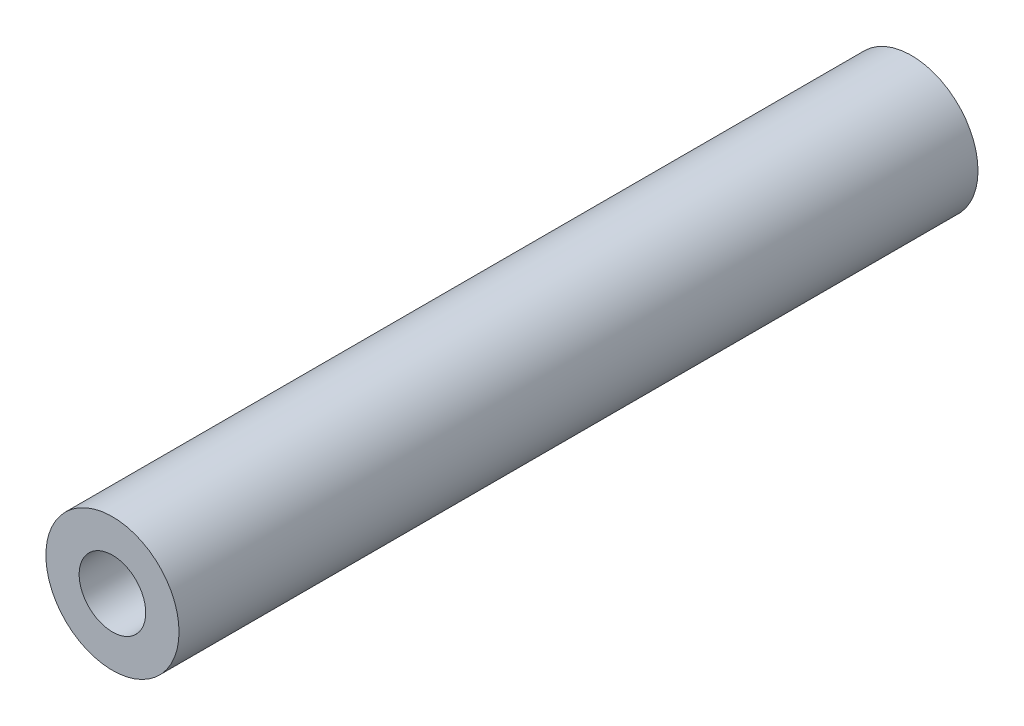
ISO-10303-21;
HEADER;
FILE_DESCRIPTION(('STEP AP214'),'2;1');
FILE_NAME('part.step','',(''),(''),'','','');
FILE_SCHEMA(('AUTOMOTIVE_DESIGN { 1 0 10303 214 1 1 1 1 }'));
ENDSEC;
DATA;
#1=APPLICATION_CONTEXT('core data for automotive mechanical design processes');
#2=APPLICATION_PROTOCOL_DEFINITION('international standard','automotive_design',2000,#1);
#3=PRODUCT_CONTEXT('',#1,'mechanical');
#4=PRODUCT('Part','Part','',(#3));
#5=PRODUCT_RELATED_PRODUCT_CATEGORY('part','',(#4));
#6=PRODUCT_DEFINITION_FORMATION('','',#4);
#7=PRODUCT_DEFINITION_CONTEXT('part definition',#1,'design');
#8=PRODUCT_DEFINITION('design','',#6,#7);
#9=PRODUCT_DEFINITION_SHAPE('','',#8);
#10=(LENGTH_UNIT() NAMED_UNIT(*) SI_UNIT(.MILLI.,.METRE.));
#11=(NAMED_UNIT(*) PLANE_ANGLE_UNIT() SI_UNIT($,.RADIAN.));
#12=(NAMED_UNIT(*) SI_UNIT($,.STERADIAN.) SOLID_ANGLE_UNIT());
#13=UNCERTAINTY_MEASURE_WITH_UNIT(LENGTH_MEASURE(1.E-05),#10,'distance_accuracy_value','');
#14=(GEOMETRIC_REPRESENTATION_CONTEXT(3) GLOBAL_UNCERTAINTY_ASSIGNED_CONTEXT((#13)) GLOBAL_UNIT_ASSIGNED_CONTEXT((#10,
#11,#12)) REPRESENTATION_CONTEXT('',''));
#15=CARTESIAN_POINT('',(0.,0.,0.));
#16=DIRECTION('',(0.,0.,1.));
#17=DIRECTION('',(1.,0.,0.));
#18=AXIS2_PLACEMENT_3D('',#15,#16,#17);
#19=CARTESIAN_POINT('',(0.,-1.0454455547614E-13,37.8036022455206));
#20=DIRECTION('',(0.,0.,1.));
#21=DIRECTION('',(1.,0.,0.));
#22=AXIS2_PLACEMENT_3D('',#19,#20,#21);
#23=PLANE('',#22);
#24=CARTESIAN_POINT('',(0.,-1.04582139736315E-13,37.8036022455206));
#25=DIRECTION('',(0.,0.,1.));
#26=DIRECTION('',(-1.,0.,0.));
#27=AXIS2_PLACEMENT_3D('',#24,#25,#26);
#28=CIRCLE('',#27,1.);
#29=CARTESIAN_POINT('',(1.00000000000006,-1.0470460441623E-13,37.8036022455206));
#30=VERTEX_POINT('',#29);
#31=EDGE_CURVE('E46',#30,#30,#28,.T.);
#32=ORIENTED_EDGE('',*,*,#31,.T.);
#33=EDGE_LOOP('',(#32));
#34=FACE_BOUND('',#33,.T.);
#35=CARTESIAN_POINT('',(0.,-1.04582139736315E-13,37.8036022455206));
#36=DIRECTION('',(0.,0.,1.));
#37=DIRECTION('',(-1.,0.,0.));
#38=AXIS2_PLACEMENT_3D('',#35,#36,#37);
#39=CIRCLE('',#38,2.);
#40=CARTESIAN_POINT('',(2.00000000000006,-1.04337210376485E-13,37.8036022455207));
#41=VERTEX_POINT('',#40);
#42=EDGE_CURVE('E11',#41,#41,#39,.T.);
#43=ORIENTED_EDGE('',*,*,#42,.F.);
#44=EDGE_LOOP('',(#43));
#45=FACE_BOUND('',#44,.T.);
#46=ADVANCED_FACE('F17',(#34,#45),#23,.F.);
#47=CARTESIAN_POINT('',(0.,0.,61.8039997615819));
#48=DIRECTION('',(0.,0.,1.));
#49=DIRECTION('',(1.,0.,0.));
#50=AXIS2_PLACEMENT_3D('',#47,#48,#49);
#51=PLANE('',#50);
#52=CARTESIAN_POINT('',(0.,0.,61.8039997615819));
#53=DIRECTION('',(0.,0.,-1.));
#54=DIRECTION('',(-1.,0.,0.));
#55=AXIS2_PLACEMENT_3D('',#52,#53,#54);
#56=CIRCLE('',#55,1.);
#57=CARTESIAN_POINT('',(0.999999999999954,0.,61.8039997615819));
#58=VERTEX_POINT('',#57);
#59=EDGE_CURVE('E56',#58,#58,#56,.T.);
#60=ORIENTED_EDGE('',*,*,#59,.T.);
#61=EDGE_LOOP('',(#60));
#62=FACE_BOUND('',#61,.T.);
#63=CARTESIAN_POINT('',(0.,0.,61.8039997615819));
#64=DIRECTION('',(0.,0.,1.));
#65=DIRECTION('',(-1.,0.,0.));
#66=AXIS2_PLACEMENT_3D('',#63,#64,#65);
#67=CIRCLE('',#66,2.);
#68=CARTESIAN_POINT('',(1.99999999999995,0.,61.8039997615819));
#69=VERTEX_POINT('',#68);
#70=EDGE_CURVE('E69',#69,#69,#67,.T.);
#71=ORIENTED_EDGE('',*,*,#70,.T.);
#72=EDGE_LOOP('',(#71));
#73=FACE_BOUND('',#72,.T.);
#74=ADVANCED_FACE('F19',(#62,#73),#51,.T.);
#75=CARTESIAN_POINT('',(-1.62237440089522E-13,0.,87.3999997615819));
#76=DIRECTION('',(0.,0.,1.));
#77=DIRECTION('',(-1.,0.,0.));
#78=AXIS2_PLACEMENT_3D('',#75,#76,#77);
#79=CYLINDRICAL_SURFACE('',#78,2.);
#80=ORIENTED_EDGE('',*,*,#70,.F.);
#81=DIRECTION('',(0.,0.,-1.));
#82=VECTOR('',#81,1.);
#83=CARTESIAN_POINT('',(1.99999999999984,0.,87.3999997615819));
#84=LINE('',#83,#82);
#85=EDGE_CURVE('E27',#69,#41,#84,.T.);
#86=ORIENTED_EDGE('',*,*,#85,.T.);
#87=ORIENTED_EDGE('',*,*,#42,.T.);
#88=ORIENTED_EDGE('',*,*,#85,.F.);
#89=EDGE_LOOP('',(#80,#86,#87,#88));
#90=FACE_BOUND('',#89,.T.);
#91=ADVANCED_FACE('F76',(#90),#79,.T.);
#92=CARTESIAN_POINT('',(-1.62237440089522E-13,0.,87.3999997615819));
#93=DIRECTION('',(0.,0.,1.));
#94=DIRECTION('',(-1.,0.,0.));
#95=AXIS2_PLACEMENT_3D('',#92,#93,#94);
#96=CYLINDRICAL_SURFACE('',#95,1.);
#97=ORIENTED_EDGE('',*,*,#59,.F.);
#98=DIRECTION('',(0.,0.,-1.));
#99=VECTOR('',#98,1.);
#100=CARTESIAN_POINT('',(0.999999999999838,0.,87.3999997615819));
#101=LINE('',#100,#99);
#102=EDGE_CURVE('E53',#58,#30,#101,.T.);
#103=ORIENTED_EDGE('',*,*,#102,.T.);
#104=ORIENTED_EDGE('',*,*,#31,.F.);
#105=ORIENTED_EDGE('',*,*,#102,.F.);
#106=EDGE_LOOP('',(#97,#103,#104,#105));
#107=FACE_BOUND('',#106,.T.);
#108=ADVANCED_FACE('F55',(#107),#96,.F.);
#109=CLOSED_SHELL('',(#46,#74,#91,#108));
#110=MANIFOLD_SOLID_BREP('B1',#109);
#111=ADVANCED_BREP_SHAPE_REPRESENTATION('',(#18,#110),#14);
#112=SHAPE_DEFINITION_REPRESENTATION(#9,#111);
ENDSEC;
END-ISO-10303-21;
